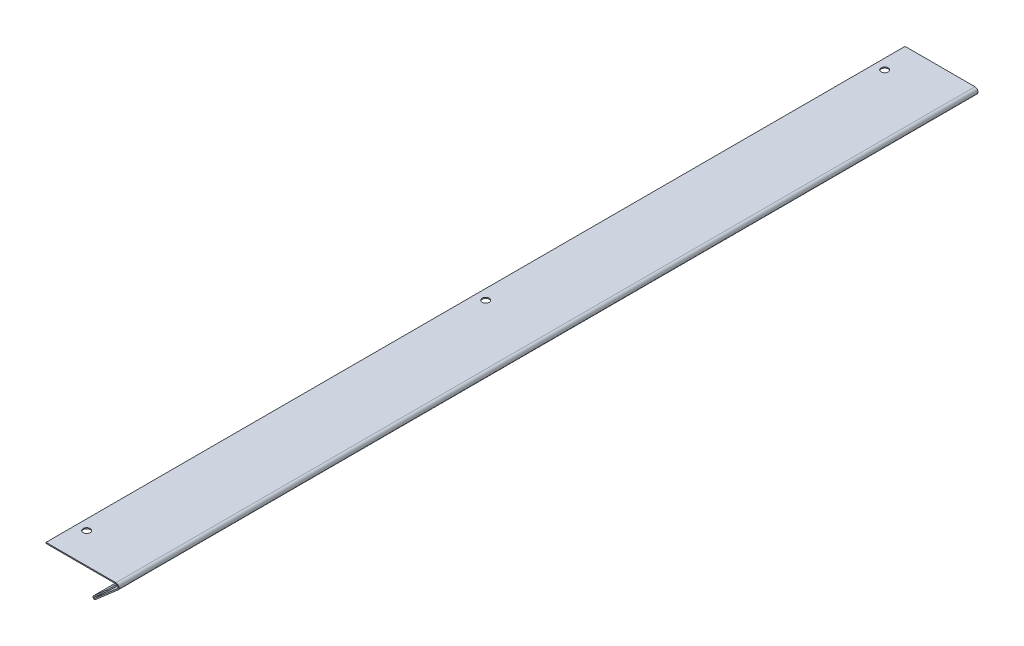
ISO-10303-21;
HEADER;
FILE_DESCRIPTION(('STEP AP214'),'2;1');
FILE_NAME('part.step','',(''),(''),'','','');
FILE_SCHEMA(('AUTOMOTIVE_DESIGN { 1 0 10303 214 1 1 1 1 }'));
ENDSEC;
DATA;
#1=APPLICATION_CONTEXT('core data for automotive mechanical design processes');
#2=APPLICATION_PROTOCOL_DEFINITION('international standard','automotive_design',2000,#1);
#3=PRODUCT_CONTEXT('',#1,'mechanical');
#4=PRODUCT('Part','Part','',(#3));
#5=PRODUCT_RELATED_PRODUCT_CATEGORY('part','',(#4));
#6=PRODUCT_DEFINITION_FORMATION('','',#4);
#7=PRODUCT_DEFINITION_CONTEXT('part definition',#1,'design');
#8=PRODUCT_DEFINITION('design','',#6,#7);
#9=PRODUCT_DEFINITION_SHAPE('','',#8);
#10=(LENGTH_UNIT() NAMED_UNIT(*) SI_UNIT(.MILLI.,.METRE.));
#11=(NAMED_UNIT(*) PLANE_ANGLE_UNIT() SI_UNIT($,.RADIAN.));
#12=(NAMED_UNIT(*) SI_UNIT($,.STERADIAN.) SOLID_ANGLE_UNIT());
#13=UNCERTAINTY_MEASURE_WITH_UNIT(LENGTH_MEASURE(1.E-05),#10,'distance_accuracy_value','');
#14=(GEOMETRIC_REPRESENTATION_CONTEXT(3) GLOBAL_UNCERTAINTY_ASSIGNED_CONTEXT((#13)) GLOBAL_UNIT_ASSIGNED_CONTEXT((#10,
#11,#12)) REPRESENTATION_CONTEXT('',''));
#15=CARTESIAN_POINT('',(0.,0.,0.));
#16=DIRECTION('',(0.,0.,1.));
#17=DIRECTION('',(1.,0.,0.));
#18=AXIS2_PLACEMENT_3D('',#15,#16,#17);
#19=CARTESIAN_POINT('',(37.3280295144952,-0.877354790111386,211.));
#20=DIRECTION('',(0.,0.,1.));
#21=DIRECTION('',(1.,0.,0.));
#22=AXIS2_PLACEMENT_3D('',#19,#20,#21);
#23=PLANE('',#22);
#24=DIRECTION('',(0.754709580222771,0.656059028990508,0.));
#25=VECTOR('',#24,1.);
#26=CARTESIAN_POINT('',(37.,-0.5,211.));
#27=LINE('',#26,#25);
#28=CARTESIAN_POINT('',(23.9812597411572,-11.8170182500863,211.));
#29=VERTEX_POINT('',#28);
#30=CARTESIAN_POINT('',(34.9814375350637,-2.2547095802227,211.));
#31=VERTEX_POINT('',#30);
#32=EDGE_CURVE('E139',#29,#31,#27,.T.);
#33=ORIENTED_EDGE('',*,*,#32,.F.);
#34=DIRECTION('',(0.656059028990513,-0.754709580222767,0.));
#35=VECTOR('',#34,1.);
#36=CARTESIAN_POINT('',(23.9812597411572,-11.8170182500863,211.));
#37=LINE('',#36,#35);
#38=CARTESIAN_POINT('',(24.3092892556525,-12.1943730401977,211.));
#39=VERTEX_POINT('',#38);
#40=EDGE_CURVE('E199',#29,#39,#37,.T.);
#41=ORIENTED_EDGE('',*,*,#40,.T.);
#42=DIRECTION('',(0.754709580222771,0.656059028990508,0.));
#43=VECTOR('',#42,1.);
#44=CARTESIAN_POINT('',(37.3280295144952,-0.877354790111386,211.));
#45=LINE('',#44,#43);
#46=CARTESIAN_POINT('',(35.3094670495589,-2.63206437033415,211.));
#47=VERTEX_POINT('',#46);
#48=EDGE_CURVE('E125',#39,#47,#45,.T.);
#49=ORIENTED_EDGE('',*,*,#48,.T.);
#50=DIRECTION('',(0.656059028990508,-0.754709580222771,0.));
#51=VECTOR('',#50,1.);
#52=CARTESIAN_POINT('',(34.9814375350637,-2.25470958022277,211.));
#53=LINE('',#52,#51);
#54=EDGE_CURVE('E153',#31,#47,#53,.T.);
#55=ORIENTED_EDGE('',*,*,#54,.F.);
#56=EDGE_LOOP('',(#33,#41,#49,#55));
#57=FACE_BOUND('',#56,.T.);
#58=ADVANCED_FACE('F36',(#57),#23,.T.);
#59=CARTESIAN_POINT('',(0.,-0.5,211.));
#60=DIRECTION('',(0.,1.,0.));
#61=DIRECTION('',(0.,0.,1.));
#62=AXIS2_PLACEMENT_3D('',#59,#60,#61);
#63=PLANE('',#62);
#64=CARTESIAN_POINT('',(5.,-0.5,196.));
#65=DIRECTION('',(0.,1.,0.));
#66=DIRECTION('',(0.,0.,1.));
#67=AXIS2_PLACEMENT_3D('',#64,#65,#66);
#68=CIRCLE('',#67,1.74999999999999);
#69=CARTESIAN_POINT('',(5.,-0.5,197.75));
#70=VERTEX_POINT('',#69);
#71=EDGE_CURVE('E102',#70,#70,#68,.T.);
#72=ORIENTED_EDGE('',*,*,#71,.T.);
#73=EDGE_LOOP('',(#72));
#74=FACE_BOUND('',#73,.T.);
#75=CARTESIAN_POINT('',(5.,-0.5,0.));
#76=DIRECTION('',(0.,1.,0.));
#77=DIRECTION('',(0.,0.,1.));
#78=AXIS2_PLACEMENT_3D('',#75,#76,#77);
#79=CIRCLE('',#78,1.75);
#80=CARTESIAN_POINT('',(5.,-0.5,1.75));
#81=VERTEX_POINT('',#80);
#82=EDGE_CURVE('E108',#81,#81,#79,.T.);
#83=ORIENTED_EDGE('',*,*,#82,.T.);
#84=EDGE_LOOP('',(#83));
#85=FACE_BOUND('',#84,.T.);
#86=CARTESIAN_POINT('',(5.,-0.5,-196.));
#87=DIRECTION('',(0.,1.,0.));
#88=DIRECTION('',(0.,0.,1.));
#89=AXIS2_PLACEMENT_3D('',#86,#87,#88);
#90=CIRCLE('',#89,1.74999999999999);
#91=CARTESIAN_POINT('',(5.,-0.5,-194.25));
#92=VERTEX_POINT('',#91);
#93=EDGE_CURVE('E87',#92,#92,#90,.T.);
#94=ORIENTED_EDGE('',*,*,#93,.T.);
#95=EDGE_LOOP('',(#94));
#96=FACE_BOUND('',#95,.T.);
#97=DIRECTION('',(0.,0.,1.));
#98=VECTOR('',#97,1.);
#99=CARTESIAN_POINT('',(34.3253785060732,-0.499999999999982,211.));
#100=LINE('',#99,#98);
#101=CARTESIAN_POINT('',(34.3253785060732,-0.499999999999982,211.));
#102=VERTEX_POINT('',#101);
#103=CARTESIAN_POINT('',(34.3253785060732,-0.50000000000007,-211.));
#104=VERTEX_POINT('',#103);
#105=EDGE_CURVE('E124',#102,#104,#100,.F.);
#106=ORIENTED_EDGE('',*,*,#105,.F.);
#107=DIRECTION('',(1.,0.,0.));
#108=VECTOR('',#107,1.);
#109=CARTESIAN_POINT('',(0.,-0.5,211.));
#110=LINE('',#109,#108);
#111=CARTESIAN_POINT('',(0.,-0.5,211.));
#112=VERTEX_POINT('',#111);
#113=EDGE_CURVE('E75',#112,#102,#110,.T.);
#114=ORIENTED_EDGE('',*,*,#113,.F.);
#115=DIRECTION('',(0.,0.,-1.));
#116=VECTOR('',#115,1.);
#117=CARTESIAN_POINT('',(0.,-0.5,211.));
#118=LINE('',#117,#116);
#119=CARTESIAN_POINT('',(0.,-0.5,-211.));
#120=VERTEX_POINT('',#119);
#121=EDGE_CURVE('E44',#112,#120,#118,.T.);
#122=ORIENTED_EDGE('',*,*,#121,.T.);
#123=DIRECTION('',(1.,0.,0.));
#124=VECTOR('',#123,1.);
#125=CARTESIAN_POINT('',(0.,-0.5,-211.));
#126=LINE('',#125,#124);
#127=EDGE_CURVE('E73',#120,#104,#126,.T.);
#128=ORIENTED_EDGE('',*,*,#127,.T.);
#129=EDGE_LOOP('',(#106,#114,#122,#128));
#130=FACE_BOUND('',#129,.T.);
#131=ADVANCED_FACE('F38',(#74,#85,#96,#130),#63,.F.);
#132=CARTESIAN_POINT('',(0.,0.,211.));
#133=DIRECTION('',(0.,1.,0.));
#134=DIRECTION('',(0.,0.,1.));
#135=AXIS2_PLACEMENT_3D('',#132,#133,#134);
#136=PLANE('',#135);
#137=CARTESIAN_POINT('',(5.,0.,-196.));
#138=DIRECTION('',(0.,1.,0.));
#139=DIRECTION('',(0.,0.,1.));
#140=AXIS2_PLACEMENT_3D('',#137,#138,#139);
#141=CIRCLE('',#140,1.74999999999999);
#142=CARTESIAN_POINT('',(5.,0.,-194.25));
#143=VERTEX_POINT('',#142);
#144=EDGE_CURVE('E111',#143,#143,#141,.T.);
#145=ORIENTED_EDGE('',*,*,#144,.F.);
#146=EDGE_LOOP('',(#145));
#147=FACE_BOUND('',#146,.T.);
#148=CARTESIAN_POINT('',(5.,0.,0.));
#149=DIRECTION('',(0.,1.,0.));
#150=DIRECTION('',(0.,0.,1.));
#151=AXIS2_PLACEMENT_3D('',#148,#149,#150);
#152=CIRCLE('',#151,1.75);
#153=CARTESIAN_POINT('',(5.,0.,1.75));
#154=VERTEX_POINT('',#153);
#155=EDGE_CURVE('E105',#154,#154,#152,.T.);
#156=ORIENTED_EDGE('',*,*,#155,.F.);
#157=EDGE_LOOP('',(#156));
#158=FACE_BOUND('',#157,.T.);
#159=CARTESIAN_POINT('',(5.,0.,196.));
#160=DIRECTION('',(0.,1.,0.));
#161=DIRECTION('',(0.,0.,1.));
#162=AXIS2_PLACEMENT_3D('',#159,#160,#161);
#163=CIRCLE('',#162,1.74999999999999);
#164=CARTESIAN_POINT('',(5.,0.,197.75));
#165=VERTEX_POINT('',#164);
#166=EDGE_CURVE('E99',#165,#165,#163,.T.);
#167=ORIENTED_EDGE('',*,*,#166,.F.);
#168=EDGE_LOOP('',(#167));
#169=FACE_BOUND('',#168,.T.);
#170=DIRECTION('',(1.,0.,0.));
#171=VECTOR('',#170,1.);
#172=CARTESIAN_POINT('',(0.,0.,211.));
#173=LINE('',#172,#171);
#174=CARTESIAN_POINT('',(0.,0.,211.));
#175=VERTEX_POINT('',#174);
#176=CARTESIAN_POINT('',(34.3253785060732,0.,211.));
#177=VERTEX_POINT('',#176);
#178=EDGE_CURVE('E92',#175,#177,#173,.T.);
#179=ORIENTED_EDGE('',*,*,#178,.T.);
#180=DIRECTION('',(0.,0.,1.));
#181=VECTOR('',#180,1.);
#182=CARTESIAN_POINT('',(34.3253785060732,0.,211.));
#183=LINE('',#182,#181);
#184=CARTESIAN_POINT('',(34.3253785060732,0.,-211.));
#185=VERTEX_POINT('',#184);
#186=EDGE_CURVE('E134',#177,#185,#183,.F.);
#187=ORIENTED_EDGE('',*,*,#186,.T.);
#188=DIRECTION('',(1.,0.,0.));
#189=VECTOR('',#188,1.);
#190=CARTESIAN_POINT('',(0.,0.,-211.));
#191=LINE('',#190,#189);
#192=CARTESIAN_POINT('',(0.,0.,-211.));
#193=VERTEX_POINT('',#192);
#194=EDGE_CURVE('E86',#193,#185,#191,.T.);
#195=ORIENTED_EDGE('',*,*,#194,.F.);
#196=DIRECTION('',(0.,0.,-1.));
#197=VECTOR('',#196,1.);
#198=CARTESIAN_POINT('',(0.,0.,211.));
#199=LINE('',#198,#197);
#200=EDGE_CURVE('E11',#175,#193,#199,.T.);
#201=ORIENTED_EDGE('',*,*,#200,.F.);
#202=EDGE_LOOP('',(#179,#187,#195,#201));
#203=FACE_BOUND('',#202,.T.);
#204=ADVANCED_FACE('F271',(#147,#158,#169,#203),#136,.T.);
#205=CARTESIAN_POINT('',(0.,0.,211.));
#206=DIRECTION('',(0.,0.,-1.));
#207=DIRECTION('',(-1.,0.,0.));
#208=AXIS2_PLACEMENT_3D('',#205,#206,#207);
#209=PLANE('',#208);
#210=DIRECTION('',(0.,1.,0.));
#211=VECTOR('',#210,1.);
#212=CARTESIAN_POINT('',(34.3253785060732,-0.499999999999982,211.));
#213=LINE('',#212,#211);
#214=EDGE_CURVE('E116',#102,#177,#213,.T.);
#215=ORIENTED_EDGE('',*,*,#214,.T.);
#216=ORIENTED_EDGE('',*,*,#178,.F.);
#217=DIRECTION('',(0.,1.,0.));
#218=VECTOR('',#217,1.);
#219=CARTESIAN_POINT('',(0.,-0.5,211.));
#220=LINE('',#219,#218);
#221=EDGE_CURVE('E77',#112,#175,#220,.T.);
#222=ORIENTED_EDGE('',*,*,#221,.F.);
#223=ORIENTED_EDGE('',*,*,#113,.T.);
#224=EDGE_LOOP('',(#215,#216,#222,#223));
#225=FACE_BOUND('',#224,.T.);
#226=ADVANCED_FACE('F359',(#225),#209,.F.);
#227=CARTESIAN_POINT('',(0.,-0.5,211.));
#228=DIRECTION('',(-1.,0.,0.));
#229=DIRECTION('',(0.,0.,1.));
#230=AXIS2_PLACEMENT_3D('',#227,#228,#229);
#231=PLANE('',#230);
#232=DIRECTION('',(0.,1.,0.));
#233=VECTOR('',#232,1.);
#234=CARTESIAN_POINT('',(0.,-0.5,-211.));
#235=LINE('',#234,#233);
#236=EDGE_CURVE('E83',#120,#193,#235,.T.);
#237=ORIENTED_EDGE('',*,*,#236,.F.);
#238=ORIENTED_EDGE('',*,*,#121,.F.);
#239=ORIENTED_EDGE('',*,*,#221,.T.);
#240=ORIENTED_EDGE('',*,*,#200,.T.);
#241=EDGE_LOOP('',(#237,#238,#239,#240));
#242=FACE_BOUND('',#241,.T.);
#243=ADVANCED_FACE('F89',(#242),#231,.T.);
#244=CARTESIAN_POINT('',(0.,0.,-211.));
#245=DIRECTION('',(0.,0.,-1.));
#246=DIRECTION('',(-1.,0.,0.));
#247=AXIS2_PLACEMENT_3D('',#244,#245,#246);
#248=PLANE('',#247);
#249=DIRECTION('',(0.,1.,0.));
#250=VECTOR('',#249,1.);
#251=CARTESIAN_POINT('',(34.3253785060732,-0.50000000000007,-211.));
#252=LINE('',#251,#250);
#253=EDGE_CURVE('E85',#104,#185,#252,.T.);
#254=ORIENTED_EDGE('',*,*,#253,.F.);
#255=ORIENTED_EDGE('',*,*,#127,.F.);
#256=ORIENTED_EDGE('',*,*,#236,.T.);
#257=ORIENTED_EDGE('',*,*,#194,.T.);
#258=EDGE_LOOP('',(#254,#255,#256,#257));
#259=FACE_BOUND('',#258,.T.);
#260=ADVANCED_FACE('F81',(#259),#248,.T.);
#261=CARTESIAN_POINT('',(5.,-0.5,196.));
#262=DIRECTION('',(0.,1.,0.));
#263=DIRECTION('',(0.,0.,1.));
#264=AXIS2_PLACEMENT_3D('',#261,#262,#263);
#265=CYLINDRICAL_SURFACE('',#264,1.74999999999999);
#266=ORIENTED_EDGE('',*,*,#71,.F.);
#267=EDGE_LOOP('',(#266));
#268=FACE_BOUND('',#267,.T.);
#269=ORIENTED_EDGE('',*,*,#166,.T.);
#270=EDGE_LOOP('',(#269));
#271=FACE_BOUND('',#270,.T.);
#272=ADVANCED_FACE('F354',(#268,#271),#265,.F.);
#273=CARTESIAN_POINT('',(5.,-0.5,0.));
#274=DIRECTION('',(0.,1.,0.));
#275=DIRECTION('',(0.,0.,1.));
#276=AXIS2_PLACEMENT_3D('',#273,#274,#275);
#277=CYLINDRICAL_SURFACE('',#276,1.75);
#278=ORIENTED_EDGE('',*,*,#82,.F.);
#279=EDGE_LOOP('',(#278));
#280=FACE_BOUND('',#279,.T.);
#281=ORIENTED_EDGE('',*,*,#155,.T.);
#282=EDGE_LOOP('',(#281));
#283=FACE_BOUND('',#282,.T.);
#284=ADVANCED_FACE('F350',(#280,#283),#277,.F.);
#285=CARTESIAN_POINT('',(5.,-0.5,-196.));
#286=DIRECTION('',(0.,1.,0.));
#287=DIRECTION('',(0.,0.,1.));
#288=AXIS2_PLACEMENT_3D('',#285,#286,#287);
#289=CYLINDRICAL_SURFACE('',#288,1.74999999999999);
#290=ORIENTED_EDGE('',*,*,#93,.F.);
#291=EDGE_LOOP('',(#290));
#292=FACE_BOUND('',#291,.T.);
#293=ORIENTED_EDGE('',*,*,#144,.T.);
#294=EDGE_LOOP('',(#293));
#295=FACE_BOUND('',#294,.T.);
#296=ADVANCED_FACE('F345',(#292,#295),#289,.F.);
#297=CARTESIAN_POINT('',(34.3253785060732,-1.50000000000004,-211.));
#298=DIRECTION('',(0.,0.,-1.));
#299=DIRECTION('',(0.,1.,0.));
#300=AXIS2_PLACEMENT_3D('',#297,#298,#299);
#301=PLANE('',#300);
#302=DIRECTION('',(0.656059028990508,-0.754709580222771,0.));
#303=VECTOR('',#302,1.);
#304=CARTESIAN_POINT('',(34.9814375350637,-2.25470958022277,-211.));
#305=LINE('',#304,#303);
#306=CARTESIAN_POINT('',(34.9814375350637,-2.25470958022279,-211.));
#307=VERTEX_POINT('',#306);
#308=CARTESIAN_POINT('',(35.3094670495589,-2.63206437033417,-211.));
#309=VERTEX_POINT('',#308);
#310=EDGE_CURVE('E154',#307,#309,#305,.T.);
#311=ORIENTED_EDGE('',*,*,#310,.F.);
#312=CARTESIAN_POINT('',(34.3253785060732,-1.50000000000004,-211.));
#313=DIRECTION('',(0.,0.,1.));
#314=DIRECTION('',(0.,-1.,0.));
#315=AXIS2_PLACEMENT_3D('',#312,#313,#314);
#316=CIRCLE('',#315,0.99999999999997);
#317=EDGE_CURVE('E128',#104,#307,#316,.F.);
#318=ORIENTED_EDGE('',*,*,#317,.F.);
#319=ORIENTED_EDGE('',*,*,#253,.T.);
#320=CARTESIAN_POINT('',(34.3253785060732,-1.50000000000004,-211.));
#321=DIRECTION('',(0.,0.,1.));
#322=DIRECTION('',(0.,-1.,0.));
#323=AXIS2_PLACEMENT_3D('',#320,#321,#322);
#324=CIRCLE('',#323,1.49999999999997);
#325=EDGE_CURVE('E119',#185,#309,#324,.F.);
#326=ORIENTED_EDGE('',*,*,#325,.T.);
#327=EDGE_LOOP('',(#311,#318,#319,#326));
#328=FACE_BOUND('',#327,.T.);
#329=ADVANCED_FACE('F243',(#328),#301,.T.);
#330=CARTESIAN_POINT('',(34.3253785060732,-1.49999999999995,211.));
#331=DIRECTION('',(0.,0.,-1.));
#332=DIRECTION('',(0.,1.,0.));
#333=AXIS2_PLACEMENT_3D('',#330,#331,#332);
#334=PLANE('',#333);
#335=CARTESIAN_POINT('',(34.3253785060732,-1.49999999999995,211.));
#336=DIRECTION('',(0.,0.,1.));
#337=DIRECTION('',(0.,-1.,0.));
#338=AXIS2_PLACEMENT_3D('',#335,#336,#337);
#339=CIRCLE('',#338,0.99999999999997);
#340=EDGE_CURVE('E121',#31,#102,#339,.T.);
#341=ORIENTED_EDGE('',*,*,#340,.F.);
#342=ORIENTED_EDGE('',*,*,#54,.T.);
#343=CARTESIAN_POINT('',(34.3253785060732,-1.49999999999995,211.));
#344=DIRECTION('',(0.,0.,1.));
#345=DIRECTION('',(0.,-1.,0.));
#346=AXIS2_PLACEMENT_3D('',#343,#344,#345);
#347=CIRCLE('',#346,1.49999999999997);
#348=EDGE_CURVE('E131',#47,#177,#347,.T.);
#349=ORIENTED_EDGE('',*,*,#348,.T.);
#350=ORIENTED_EDGE('',*,*,#214,.F.);
#351=EDGE_LOOP('',(#341,#342,#349,#350));
#352=FACE_BOUND('',#351,.T.);
#353=ADVANCED_FACE('F262',(#352),#334,.F.);
#354=CARTESIAN_POINT('',(34.3253785060732,-1.49999999999995,211.));
#355=DIRECTION('',(0.,0.,1.));
#356=DIRECTION('',(0.656059028990508,-0.754709580222771,0.));
#357=AXIS2_PLACEMENT_3D('',#354,#355,#356);
#358=CYLINDRICAL_SURFACE('',#357,1.49999999999997);
#359=ORIENTED_EDGE('',*,*,#186,.F.);
#360=ORIENTED_EDGE('',*,*,#348,.F.);
#361=DIRECTION('',(0.,0.,1.));
#362=VECTOR('',#361,1.);
#363=CARTESIAN_POINT('',(35.309467049559,-2.63206437033416,0.));
#364=LINE('',#363,#362);
#365=EDGE_CURVE('E146',#309,#47,#364,.T.);
#366=ORIENTED_EDGE('',*,*,#365,.F.);
#367=ORIENTED_EDGE('',*,*,#325,.F.);
#368=EDGE_LOOP('',(#359,#360,#366,#367));
#369=FACE_BOUND('',#368,.T.);
#370=ADVANCED_FACE('F268',(#369),#358,.T.);
#371=CARTESIAN_POINT('',(34.3253785060732,-1.49999999999995,211.));
#372=DIRECTION('',(0.,0.,1.));
#373=DIRECTION('',(0.656059028990508,-0.754709580222771,0.));
#374=AXIS2_PLACEMENT_3D('',#371,#372,#373);
#375=CYLINDRICAL_SURFACE('',#374,0.99999999999997);
#376=ORIENTED_EDGE('',*,*,#105,.T.);
#377=ORIENTED_EDGE('',*,*,#317,.T.);
#378=DIRECTION('',(0.,0.,1.));
#379=VECTOR('',#378,1.);
#380=CARTESIAN_POINT('',(34.9814375350637,-2.25470958022277,-211.));
#381=LINE('',#380,#379);
#382=EDGE_CURVE('E157',#307,#31,#381,.T.);
#383=ORIENTED_EDGE('',*,*,#382,.T.);
#384=ORIENTED_EDGE('',*,*,#340,.T.);
#385=EDGE_LOOP('',(#376,#377,#383,#384));
#386=FACE_BOUND('',#385,.T.);
#387=ADVANCED_FACE('F250',(#386),#375,.F.);
#388=CARTESIAN_POINT('',(23.7432570704854,-12.6864173119405,-211.));
#389=DIRECTION('',(0.,0.,-1.));
#390=DIRECTION('',(-1.,0.,0.));
#391=AXIS2_PLACEMENT_3D('',#388,#389,#390);
#392=PLANE('',#391);
#393=DIRECTION('',(0.656059028990513,-0.754709580222767,0.));
#394=VECTOR('',#393,1.);
#395=CARTESIAN_POINT('',(23.9812597411572,-11.8170182500863,-211.));
#396=LINE('',#395,#394);
#397=CARTESIAN_POINT('',(23.9812597411572,-11.8170182500863,-211.));
#398=VERTEX_POINT('',#397);
#399=CARTESIAN_POINT('',(24.3092892556525,-12.1943730401977,-211.));
#400=VERTEX_POINT('',#399);
#401=EDGE_CURVE('E179',#398,#400,#396,.T.);
#402=ORIENTED_EDGE('',*,*,#401,.F.);
#403=DIRECTION('',(-0.754709580222771,-0.656059028990508,0.));
#404=VECTOR('',#403,1.);
#405=CARTESIAN_POINT('',(23.4152275559901,-12.3090625218292,-211.));
#406=LINE('',#405,#404);
#407=EDGE_CURVE('E143',#307,#398,#406,.T.);
#408=ORIENTED_EDGE('',*,*,#407,.F.);
#409=ORIENTED_EDGE('',*,*,#310,.T.);
#410=DIRECTION('',(-0.754709580222771,-0.656059028990508,0.));
#411=VECTOR('',#410,1.);
#412=CARTESIAN_POINT('',(23.7432570704854,-12.6864173119405,-211.));
#413=LINE('',#412,#411);
#414=EDGE_CURVE('E142',#309,#400,#413,.T.);
#415=ORIENTED_EDGE('',*,*,#414,.T.);
#416=EDGE_LOOP('',(#402,#408,#409,#415));
#417=FACE_BOUND('',#416,.T.);
#418=ADVANCED_FACE('F233',(#417),#392,.T.);
#419=CARTESIAN_POINT('',(16.5008941639195,-18.9821073370705,0.));
#420=DIRECTION('',(0.656059028990508,-0.754709580222771,0.));
#421=DIRECTION('',(0.754709580222771,0.656059028990508,0.));
#422=AXIS2_PLACEMENT_3D('',#419,#420,#421);
#423=PLANE('',#422);
#424=DIRECTION('',(0.,0.,1.));
#425=VECTOR('',#424,1.);
#426=CARTESIAN_POINT('',(24.3092892556525,-12.1943730401977,211.));
#427=LINE('',#426,#425);
#428=EDGE_CURVE('E214',#39,#400,#427,.F.);
#429=ORIENTED_EDGE('',*,*,#428,.T.);
#430=ORIENTED_EDGE('',*,*,#414,.F.);
#431=ORIENTED_EDGE('',*,*,#365,.T.);
#432=ORIENTED_EDGE('',*,*,#48,.F.);
#433=EDGE_LOOP('',(#429,#430,#431,#432));
#434=FACE_BOUND('',#433,.T.);
#435=ADVANCED_FACE('F223',(#434),#423,.T.);
#436=CARTESIAN_POINT('',(16.1728646494242,-18.6047525469591,0.));
#437=DIRECTION('',(0.656059028990508,-0.754709580222771,0.));
#438=DIRECTION('',(0.754709580222771,0.656059028990508,0.));
#439=AXIS2_PLACEMENT_3D('',#436,#437,#438);
#440=PLANE('',#439);
#441=ORIENTED_EDGE('',*,*,#407,.T.);
#442=DIRECTION('',(0.,0.,1.));
#443=VECTOR('',#442,1.);
#444=CARTESIAN_POINT('',(23.9812597411572,-11.8170182500863,211.));
#445=LINE('',#444,#443);
#446=EDGE_CURVE('E206',#29,#398,#445,.F.);
#447=ORIENTED_EDGE('',*,*,#446,.F.);
#448=ORIENTED_EDGE('',*,*,#32,.T.);
#449=ORIENTED_EDGE('',*,*,#382,.F.);
#450=EDGE_LOOP('',(#441,#447,#448,#449));
#451=FACE_BOUND('',#450,.T.);
#452=ADVANCED_FACE('F253',(#451),#440,.F.);
#453=CARTESIAN_POINT('',(26.815732520697,-8.0280356607824,211.));
#454=DIRECTION('',(0.,0.,-1.));
#455=DIRECTION('',(-0.754709580222771,-0.656059028990508,0.));
#456=AXIS2_PLACEMENT_3D('',#453,#454,#455);
#457=PLANE('',#456);
#458=DIRECTION('',(-0.656059028990508,0.754709580222771,0.));
#459=VECTOR('',#458,1.);
#460=CARTESIAN_POINT('',(23.3252007121667,-11.0623086698635,211.));
#461=LINE('',#460,#459);
#462=CARTESIAN_POINT('',(23.653230226662,-11.4396634599749,211.));
#463=VERTEX_POINT('',#462);
#464=CARTESIAN_POINT('',(23.3252007121667,-11.0623086698635,211.));
#465=VERTEX_POINT('',#464);
#466=EDGE_CURVE('E170',#463,#465,#461,.T.);
#467=ORIENTED_EDGE('',*,*,#466,.F.);
#468=DIRECTION('',(-0.754709580222771,-0.656059028990508,0.));
#469=VECTOR('',#468,1.);
#470=CARTESIAN_POINT('',(27.1437620351923,-8.40539045089379,211.));
#471=LINE('',#470,#469);
#472=CARTESIAN_POINT('',(30.6342938437226,-5.37111744181268,211.));
#473=VERTEX_POINT('',#472);
#474=EDGE_CURVE('E182',#473,#463,#471,.T.);
#475=ORIENTED_EDGE('',*,*,#474,.F.);
#476=DIRECTION('',(-0.656059028990508,0.754709580222771,0.));
#477=VECTOR('',#476,1.);
#478=CARTESIAN_POINT('',(30.3062643292273,-4.9937626517013,211.));
#479=LINE('',#478,#477);
#480=CARTESIAN_POINT('',(30.3062643292273,-4.9937626517013,211.));
#481=VERTEX_POINT('',#480);
#482=EDGE_CURVE('E166',#473,#481,#479,.T.);
#483=ORIENTED_EDGE('',*,*,#482,.T.);
#484=DIRECTION('',(-0.754709580222771,-0.656059028990508,0.));
#485=VECTOR('',#484,1.);
#486=CARTESIAN_POINT('',(26.815732520697,-8.0280356607824,211.));
#487=LINE('',#486,#485);
#488=EDGE_CURVE('E194',#481,#465,#487,.T.);
#489=ORIENTED_EDGE('',*,*,#488,.T.);
#490=EDGE_LOOP('',(#467,#475,#483,#489));
#491=FACE_BOUND('',#490,.T.);
#492=ADVANCED_FACE('F314',(#491),#457,.F.);
#493=CARTESIAN_POINT('',(30.3062643292273,-4.9937626517013,0.));
#494=DIRECTION('',(-0.754709580222771,-0.656059028990508,0.));
#495=DIRECTION('',(0.,0.,1.));
#496=AXIS2_PLACEMENT_3D('',#493,#494,#495);
#497=PLANE('',#496);
#498=ORIENTED_EDGE('',*,*,#482,.F.);
#499=DIRECTION('',(0.,0.,1.));
#500=VECTOR('',#499,1.);
#501=CARTESIAN_POINT('',(30.6342938437226,-5.37111744181268,0.));
#502=LINE('',#501,#500);
#503=CARTESIAN_POINT('',(30.6342938437226,-5.37111744181268,-211.));
#504=VERTEX_POINT('',#503);
#505=EDGE_CURVE('E185',#504,#473,#502,.T.);
#506=ORIENTED_EDGE('',*,*,#505,.F.);
#507=DIRECTION('',(-0.656059028990508,0.754709580222771,0.));
#508=VECTOR('',#507,1.);
#509=CARTESIAN_POINT('',(30.3062643292273,-4.9937626517013,-211.));
#510=LINE('',#509,#508);
#511=CARTESIAN_POINT('',(30.3062643292273,-4.9937626517013,-211.));
#512=VERTEX_POINT('',#511);
#513=EDGE_CURVE('E163',#504,#512,#510,.T.);
#514=ORIENTED_EDGE('',*,*,#513,.T.);
#515=DIRECTION('',(0.,0.,1.));
#516=VECTOR('',#515,1.);
#517=CARTESIAN_POINT('',(30.3062643292273,-4.9937626517013,0.));
#518=LINE('',#517,#516);
#519=EDGE_CURVE('E167',#512,#481,#518,.T.);
#520=ORIENTED_EDGE('',*,*,#519,.T.);
#521=EDGE_LOOP('',(#498,#506,#514,#520));
#522=FACE_BOUND('',#521,.T.);
#523=ADVANCED_FACE('F318',(#522),#497,.F.);
#524=CARTESIAN_POINT('',(26.815732520697,-8.0280356607824,-211.));
#525=DIRECTION('',(0.,0.,1.));
#526=DIRECTION('',(0.754709580222771,0.656059028990508,0.));
#527=AXIS2_PLACEMENT_3D('',#524,#525,#526);
#528=PLANE('',#527);
#529=DIRECTION('',(-0.754709580222771,-0.656059028990508,0.));
#530=VECTOR('',#529,1.);
#531=CARTESIAN_POINT('',(27.1437620351923,-8.40539045089379,-211.));
#532=LINE('',#531,#530);
#533=CARTESIAN_POINT('',(23.653230226662,-11.4396634599749,-211.));
#534=VERTEX_POINT('',#533);
#535=EDGE_CURVE('E175',#534,#504,#532,.F.);
#536=ORIENTED_EDGE('',*,*,#535,.F.);
#537=DIRECTION('',(-0.656059028990508,0.754709580222771,0.));
#538=VECTOR('',#537,1.);
#539=CARTESIAN_POINT('',(23.3252007121667,-11.0623086698635,-211.));
#540=LINE('',#539,#538);
#541=CARTESIAN_POINT('',(23.3252007121667,-11.0623086698635,-211.));
#542=VERTEX_POINT('',#541);
#543=EDGE_CURVE('E158',#534,#542,#540,.T.);
#544=ORIENTED_EDGE('',*,*,#543,.T.);
#545=DIRECTION('',(0.754709580222771,0.656059028990508,0.));
#546=VECTOR('',#545,1.);
#547=CARTESIAN_POINT('',(26.815732520697,-8.0280356607824,-211.));
#548=LINE('',#547,#546);
#549=EDGE_CURVE('E188',#542,#512,#548,.T.);
#550=ORIENTED_EDGE('',*,*,#549,.T.);
#551=ORIENTED_EDGE('',*,*,#513,.F.);
#552=EDGE_LOOP('',(#536,#544,#550,#551));
#553=FACE_BOUND('',#552,.T.);
#554=ADVANCED_FACE('F303',(#553),#528,.F.);
#555=CARTESIAN_POINT('',(26.815732520697,-8.0280356607824,0.));
#556=DIRECTION('',(-0.656059028990508,0.754709580222771,0.));
#557=DIRECTION('',(-0.754709580222771,-0.656059028990508,0.));
#558=AXIS2_PLACEMENT_3D('',#555,#556,#557);
#559=PLANE('',#558);
#560=ORIENTED_EDGE('',*,*,#519,.F.);
#561=ORIENTED_EDGE('',*,*,#549,.F.);
#562=DIRECTION('',(0.,0.,-1.));
#563=VECTOR('',#562,1.);
#564=CARTESIAN_POINT('',(23.3252007121667,-11.0623086698635,0.));
#565=LINE('',#564,#563);
#566=EDGE_CURVE('E191',#465,#542,#565,.T.);
#567=ORIENTED_EDGE('',*,*,#566,.F.);
#568=ORIENTED_EDGE('',*,*,#488,.F.);
#569=EDGE_LOOP('',(#560,#561,#567,#568));
#570=FACE_BOUND('',#569,.T.);
#571=ADVANCED_FACE('F298',(#570),#559,.T.);
#572=CARTESIAN_POINT('',(27.1437620351923,-8.40539045089379,0.));
#573=DIRECTION('',(-0.656059028990508,0.754709580222771,0.));
#574=DIRECTION('',(-0.754709580222771,-0.656059028990508,0.));
#575=AXIS2_PLACEMENT_3D('',#572,#573,#574);
#576=PLANE('',#575);
#577=ORIENTED_EDGE('',*,*,#505,.T.);
#578=ORIENTED_EDGE('',*,*,#474,.T.);
#579=DIRECTION('',(0.,0.,1.));
#580=VECTOR('',#579,1.);
#581=CARTESIAN_POINT('',(23.653230226662,-11.4396634599749,0.));
#582=LINE('',#581,#580);
#583=EDGE_CURVE('E178',#463,#534,#582,.F.);
#584=ORIENTED_EDGE('',*,*,#583,.T.);
#585=ORIENTED_EDGE('',*,*,#535,.T.);
#586=EDGE_LOOP('',(#577,#578,#584,#585));
#587=FACE_BOUND('',#586,.T.);
#588=ADVANCED_FACE('F315',(#587),#576,.F.);
#589=CARTESIAN_POINT('',(23.8172449839096,-11.6283408550306,-211.));
#590=DIRECTION('',(0.,0.,-1.));
#591=DIRECTION('',(-1.,0.,0.));
#592=AXIS2_PLACEMENT_3D('',#589,#590,#591);
#593=PLANE('',#592);
#594=ORIENTED_EDGE('',*,*,#543,.F.);
#595=CARTESIAN_POINT('',(23.8172449839096,-11.6283408550306,-211.));
#596=DIRECTION('',(0.,0.,1.));
#597=DIRECTION('',(1.,0.,0.));
#598=AXIS2_PLACEMENT_3D('',#595,#596,#597);
#599=CIRCLE('',#598,0.249999999999996);
#600=EDGE_CURVE('E208',#398,#534,#599,.F.);
#601=ORIENTED_EDGE('',*,*,#600,.F.);
#602=ORIENTED_EDGE('',*,*,#401,.T.);
#603=CARTESIAN_POINT('',(23.8172449839096,-11.6283408550306,-211.));
#604=DIRECTION('',(0.,0.,1.));
#605=DIRECTION('',(1.,0.,0.));
#606=AXIS2_PLACEMENT_3D('',#603,#604,#605);
#607=CIRCLE('',#606,0.749999999999996);
#608=EDGE_CURVE('E202',#400,#542,#607,.F.);
#609=ORIENTED_EDGE('',*,*,#608,.T.);
#610=EDGE_LOOP('',(#594,#601,#602,#609));
#611=FACE_BOUND('',#610,.T.);
#612=ADVANCED_FACE('F307',(#611),#593,.T.);
#613=CARTESIAN_POINT('',(23.8172449839096,-11.6283408550306,211.));
#614=DIRECTION('',(0.,0.,-1.));
#615=DIRECTION('',(-1.,0.,0.));
#616=AXIS2_PLACEMENT_3D('',#613,#614,#615);
#617=PLANE('',#616);
#618=CARTESIAN_POINT('',(23.8172449839096,-11.6283408550306,211.));
#619=DIRECTION('',(0.,0.,1.));
#620=DIRECTION('',(1.,0.,0.));
#621=AXIS2_PLACEMENT_3D('',#618,#619,#620);
#622=CIRCLE('',#621,0.249999999999996);
#623=EDGE_CURVE('E51',#463,#29,#622,.T.);
#624=ORIENTED_EDGE('',*,*,#623,.F.);
#625=ORIENTED_EDGE('',*,*,#466,.T.);
#626=CARTESIAN_POINT('',(23.8172449839096,-11.6283408550306,211.));
#627=DIRECTION('',(0.,0.,1.));
#628=DIRECTION('',(1.,0.,0.));
#629=AXIS2_PLACEMENT_3D('',#626,#627,#628);
#630=CIRCLE('',#629,0.749999999999996);
#631=EDGE_CURVE('E211',#465,#39,#630,.T.);
#632=ORIENTED_EDGE('',*,*,#631,.T.);
#633=ORIENTED_EDGE('',*,*,#40,.F.);
#634=EDGE_LOOP('',(#624,#625,#632,#633));
#635=FACE_BOUND('',#634,.T.);
#636=ADVANCED_FACE('F311',(#635),#617,.F.);
#637=CARTESIAN_POINT('',(23.8172449839096,-11.6283408550306,211.));
#638=DIRECTION('',(0.,0.,1.));
#639=DIRECTION('',(-0.656059028990508,0.754709580222771,0.));
#640=AXIS2_PLACEMENT_3D('',#637,#638,#639);
#641=CYLINDRICAL_SURFACE('',#640,0.749999999999996);
#642=ORIENTED_EDGE('',*,*,#428,.F.);
#643=ORIENTED_EDGE('',*,*,#631,.F.);
#644=ORIENTED_EDGE('',*,*,#566,.T.);
#645=ORIENTED_EDGE('',*,*,#608,.F.);
#646=EDGE_LOOP('',(#642,#643,#644,#645));
#647=FACE_BOUND('',#646,.T.);
#648=ADVANCED_FACE('F306',(#647),#641,.T.);
#649=CARTESIAN_POINT('',(23.8172449839096,-11.6283408550306,211.));
#650=DIRECTION('',(0.,0.,1.));
#651=DIRECTION('',(-0.656059028990508,0.754709580222771,0.));
#652=AXIS2_PLACEMENT_3D('',#649,#650,#651);
#653=CYLINDRICAL_SURFACE('',#652,0.249999999999996);
#654=ORIENTED_EDGE('',*,*,#446,.T.);
#655=ORIENTED_EDGE('',*,*,#600,.T.);
#656=ORIENTED_EDGE('',*,*,#583,.F.);
#657=ORIENTED_EDGE('',*,*,#623,.T.);
#658=EDGE_LOOP('',(#654,#655,#656,#657));
#659=FACE_BOUND('',#658,.T.);
#660=ADVANCED_FACE('F308',(#659),#653,.F.);
#661=CLOSED_SHELL('',(#58,#131,#204,#226,#243,#260,#272,#284,#296,#329,#353,#370,#387,#418,#435,
#452,#492,#523,#554,#571,#588,#612,#636,#648,#660));
#662=MANIFOLD_SOLID_BREP('B2',#661);
#663=ADVANCED_BREP_SHAPE_REPRESENTATION('',(#18,#662),#14);
#664=SHAPE_DEFINITION_REPRESENTATION(#9,#663);
ENDSEC;
END-ISO-10303-21;
